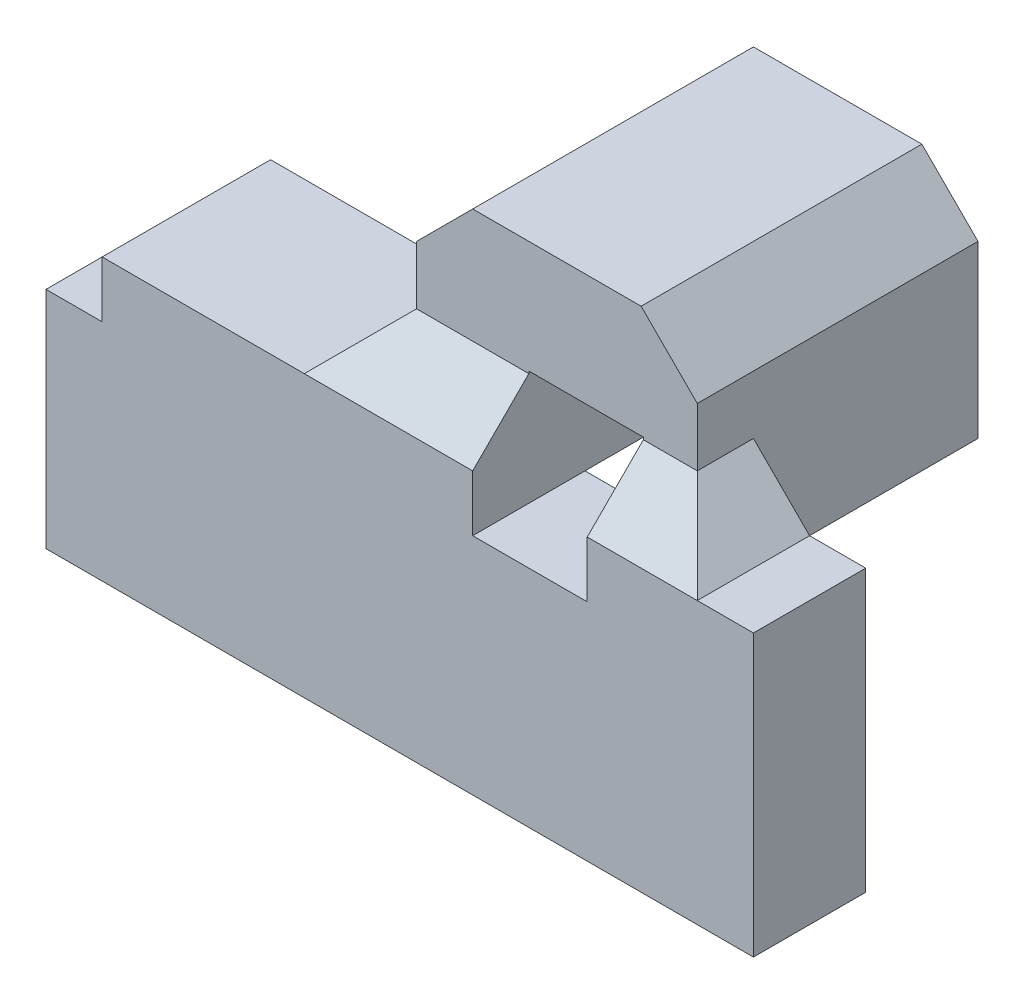
ISO-10303-21;
HEADER;
FILE_DESCRIPTION(('STEP AP214'),'2;1');
FILE_NAME('part.step','',(''),(''),'','','');
FILE_SCHEMA(('AUTOMOTIVE_DESIGN { 1 0 10303 214 1 1 1 1 }'));
ENDSEC;
DATA;
#1=APPLICATION_CONTEXT('core data for automotive mechanical design processes');
#2=APPLICATION_PROTOCOL_DEFINITION('international standard','automotive_design',2000,#1);
#3=PRODUCT_CONTEXT('',#1,'mechanical');
#4=PRODUCT('Part','Part','',(#3));
#5=PRODUCT_RELATED_PRODUCT_CATEGORY('part','',(#4));
#6=PRODUCT_DEFINITION_FORMATION('','',#4);
#7=PRODUCT_DEFINITION_CONTEXT('part definition',#1,'design');
#8=PRODUCT_DEFINITION('design','',#6,#7);
#9=PRODUCT_DEFINITION_SHAPE('','',#8);
#10=(LENGTH_UNIT() NAMED_UNIT(*) SI_UNIT(.MILLI.,.METRE.));
#11=(NAMED_UNIT(*) PLANE_ANGLE_UNIT() SI_UNIT($,.RADIAN.));
#12=(NAMED_UNIT(*) SI_UNIT($,.STERADIAN.) SOLID_ANGLE_UNIT());
#13=UNCERTAINTY_MEASURE_WITH_UNIT(LENGTH_MEASURE(1.E-05),#10,'distance_accuracy_value','');
#14=(GEOMETRIC_REPRESENTATION_CONTEXT(3) GLOBAL_UNCERTAINTY_ASSIGNED_CONTEXT((#13)) GLOBAL_UNIT_ASSIGNED_CONTEXT((#10,
#11,#12)) REPRESENTATION_CONTEXT('',''));
#15=CARTESIAN_POINT('',(0.,0.,0.));
#16=DIRECTION('',(0.,0.,1.));
#17=DIRECTION('',(1.,0.,0.));
#18=AXIS2_PLACEMENT_3D('',#15,#16,#17);
#19=CARTESIAN_POINT('',(-44.8113883008419,0.,-5.));
#20=DIRECTION('',(0.,0.,-1.));
#21=DIRECTION('',(-1.,0.,0.));
#22=AXIS2_PLACEMENT_3D('',#19,#20,#21);
#23=PLANE('',#22);
#24=DIRECTION('',(1.,0.,0.));
#25=VECTOR('',#24,1.);
#26=CARTESIAN_POINT('',(-44.8113883008419,15.,-5.));
#27=LINE('',#26,#25);
#28=CARTESIAN_POINT('',(-29.,15.,-5.));
#29=VERTEX_POINT('',#28);
#30=CARTESIAN_POINT('',(-11.,15.,-5.));
#31=VERTEX_POINT('',#30);
#32=EDGE_CURVE('E374',#29,#31,#27,.T.);
#33=ORIENTED_EDGE('',*,*,#32,.T.);
#34=DIRECTION('',(0.707106781186544,0.707106781186551,0.));
#35=VECTOR('',#34,1.);
#36=CARTESIAN_POINT('',(-11.,15.,-5.));
#37=LINE('',#36,#35);
#38=CARTESIAN_POINT('',(-6.,20.,-5.));
#39=VERTEX_POINT('',#38);
#40=EDGE_CURVE('E70',#31,#39,#37,.T.);
#41=ORIENTED_EDGE('',*,*,#40,.T.);
#42=DIRECTION('',(0.,-1.,0.));
#43=VECTOR('',#42,1.);
#44=CARTESIAN_POINT('',(-6.,0.,-5.));
#45=LINE('',#44,#43);
#46=CARTESIAN_POINT('',(-6.,10.,-5.));
#47=VERTEX_POINT('',#46);
#48=EDGE_CURVE('E63',#39,#47,#45,.T.);
#49=ORIENTED_EDGE('',*,*,#48,.T.);
#50=DIRECTION('',(1.,0.,0.));
#51=VECTOR('',#50,1.);
#52=CARTESIAN_POINT('',(-44.8113883008419,10.,-5.));
#53=LINE('',#52,#51);
#54=CARTESIAN_POINT('',(-29.,10.,-5.));
#55=VERTEX_POINT('',#54);
#56=EDGE_CURVE('E369',#55,#47,#53,.T.);
#57=ORIENTED_EDGE('',*,*,#56,.F.);
#58=DIRECTION('',(0.,-1.,0.));
#59=VECTOR('',#58,1.);
#60=CARTESIAN_POINT('',(-29.,0.,-5.));
#61=LINE('',#60,#59);
#62=EDGE_CURVE('E357',#29,#55,#61,.T.);
#63=ORIENTED_EDGE('',*,*,#62,.F.);
#64=EDGE_LOOP('',(#33,#41,#49,#57,#63));
#65=FACE_BOUND('',#64,.T.);
#66=ADVANCED_FACE('F47',(#65),#23,.T.);
#67=CARTESIAN_POINT('',(-44.8113883008419,15.,0.));
#68=DIRECTION('',(0.,1.,0.));
#69=DIRECTION('',(-1.,0.,0.));
#70=AXIS2_PLACEMENT_3D('',#67,#68,#69);
#71=PLANE('',#70);
#72=DIRECTION('',(1.,0.,0.));
#73=VECTOR('',#72,1.);
#74=CARTESIAN_POINT('',(-44.8113883008419,15.,10.));
#75=LINE('',#74,#73);
#76=CARTESIAN_POINT('',(-29.,15.,10.));
#77=VERTEX_POINT('',#76);
#78=CARTESIAN_POINT('',(-11.,15.,10.));
#79=VERTEX_POINT('',#78);
#80=EDGE_CURVE('E360',#77,#79,#75,.T.);
#81=ORIENTED_EDGE('',*,*,#80,.T.);
#82=DIRECTION('',(0.,0.,-1.));
#83=VECTOR('',#82,1.);
#84=CARTESIAN_POINT('',(-11.,15.,0.));
#85=LINE('',#84,#83);
#86=EDGE_CURVE('E246',#79,#31,#85,.T.);
#87=ORIENTED_EDGE('',*,*,#86,.T.);
#88=ORIENTED_EDGE('',*,*,#32,.F.);
#89=DIRECTION('',(0.,0.,-1.));
#90=VECTOR('',#89,1.);
#91=CARTESIAN_POINT('',(-29.,15.,0.));
#92=LINE('',#91,#90);
#93=EDGE_CURVE('E359',#77,#29,#92,.T.);
#94=ORIENTED_EDGE('',*,*,#93,.F.);
#95=EDGE_LOOP('',(#81,#87,#88,#94));
#96=FACE_BOUND('',#95,.T.);
#97=ADVANCED_FACE('F496',(#96),#71,.T.);
#98=DIRECTION('',(1.,0.,0.));
#99=VECTOR('',#98,1.);
#100=CARTESIAN_POINT('',(-44.8113883008419,15.,0.));
#101=LINE('',#100,#99);
#102=CARTESIAN_POINT('',(24.,15.,0.));
#103=VERTEX_POINT('',#102);
#104=CARTESIAN_POINT('',(29.,15.,0.));
#105=VERTEX_POINT('',#104);
#106=EDGE_CURVE('E220',#103,#105,#101,.T.);
#107=ORIENTED_EDGE('',*,*,#106,.F.);
#108=DIRECTION('',(0.,0.,1.));
#109=VECTOR('',#108,1.);
#110=CARTESIAN_POINT('',(24.,15.,5.));
#111=LINE('',#110,#109);
#112=CARTESIAN_POINT('',(24.,15.,10.));
#113=VERTEX_POINT('',#112);
#114=EDGE_CURVE('E229',#103,#113,#111,.T.);
#115=ORIENTED_EDGE('',*,*,#114,.T.);
#116=CARTESIAN_POINT('',(29.,15.,10.));
#117=VERTEX_POINT('',#116);
#118=EDGE_CURVE('E377',#113,#117,#75,.T.);
#119=ORIENTED_EDGE('',*,*,#118,.T.);
#120=DIRECTION('',(0.,0.,1.));
#121=VECTOR('',#120,1.);
#122=CARTESIAN_POINT('',(29.,15.,0.));
#123=LINE('',#122,#121);
#124=EDGE_CURVE('E367',#105,#117,#123,.T.);
#125=ORIENTED_EDGE('',*,*,#124,.F.);
#126=EDGE_LOOP('',(#107,#115,#119,#125));
#127=FACE_BOUND('',#126,.T.);
#128=ADVANCED_FACE('F502',(#127),#71,.T.);
#129=CARTESIAN_POINT('',(-29.,-10.,5.));
#130=DIRECTION('',(1.,0.,0.));
#131=DIRECTION('',(0.,1.,0.));
#132=AXIS2_PLACEMENT_3D('',#129,#130,#131);
#133=PLANE('',#132);
#134=DIRECTION('',(0.,0.,1.));
#135=VECTOR('',#134,1.);
#136=CARTESIAN_POINT('',(-29.,10.,0.));
#137=LINE('',#136,#135);
#138=CARTESIAN_POINT('',(-29.,10.,0.));
#139=VERTEX_POINT('',#138);
#140=EDGE_CURVE('E380',#55,#139,#137,.T.);
#141=ORIENTED_EDGE('',*,*,#140,.T.);
#142=CARTESIAN_POINT('',(-29.,10.,9.99999999999999));
#143=VERTEX_POINT('',#142);
#144=EDGE_CURVE('E364',#139,#143,#137,.T.);
#145=ORIENTED_EDGE('',*,*,#144,.T.);
#146=DIRECTION('',(0.,1.,0.));
#147=VECTOR('',#146,1.);
#148=CARTESIAN_POINT('',(-29.,0.,10.));
#149=LINE('',#148,#147);
#150=EDGE_CURVE('E362',#143,#77,#149,.T.);
#151=ORIENTED_EDGE('',*,*,#150,.T.);
#152=ORIENTED_EDGE('',*,*,#93,.T.);
#153=ORIENTED_EDGE('',*,*,#62,.T.);
#154=EDGE_LOOP('',(#141,#145,#151,#152,#153));
#155=FACE_BOUND('',#154,.T.);
#156=ADVANCED_FACE('F475',(#155),#133,.F.);
#157=CARTESIAN_POINT('',(29.,-10.,5.));
#158=DIRECTION('',(-1.,0.,0.));
#159=DIRECTION('',(0.,-1.,0.));
#160=AXIS2_PLACEMENT_3D('',#157,#158,#159);
#161=PLANE('',#160);
#162=DIRECTION('',(0.,1.,0.));
#163=VECTOR('',#162,1.);
#164=CARTESIAN_POINT('',(29.,-10.,0.));
#165=LINE('',#164,#163);
#166=CARTESIAN_POINT('',(29.,-10.,0.));
#167=VERTEX_POINT('',#166);
#168=EDGE_CURVE('E383',#167,#105,#165,.T.);
#169=ORIENTED_EDGE('',*,*,#168,.T.);
#170=ORIENTED_EDGE('',*,*,#124,.T.);
#171=DIRECTION('',(0.,-1.,0.));
#172=VECTOR('',#171,1.);
#173=CARTESIAN_POINT('',(29.,0.,10.));
#174=LINE('',#173,#172);
#175=CARTESIAN_POINT('',(29.,-10.,9.99999999999999));
#176=VERTEX_POINT('',#175);
#177=EDGE_CURVE('E354',#117,#176,#174,.T.);
#178=ORIENTED_EDGE('',*,*,#177,.T.);
#179=DIRECTION('',(0.,0.,-1.));
#180=VECTOR('',#179,1.);
#181=CARTESIAN_POINT('',(29.,-10.,5.));
#182=LINE('',#181,#180);
#183=EDGE_CURVE('E287',#176,#167,#182,.T.);
#184=ORIENTED_EDGE('',*,*,#183,.T.);
#185=EDGE_LOOP('',(#169,#170,#178,#184));
#186=FACE_BOUND('',#185,.T.);
#187=ADVANCED_FACE('F515',(#186),#161,.F.);
#188=CARTESIAN_POINT('',(-29.,-10.,5.));
#189=DIRECTION('',(0.,1.,0.));
#190=DIRECTION('',(0.,0.,1.));
#191=AXIS2_PLACEMENT_3D('',#188,#189,#190);
#192=PLANE('',#191);
#193=CARTESIAN_POINT('',(-19.,-10.,4.99999999999999));
#194=DIRECTION('',(0.,-1.,0.));
#195=DIRECTION('',(0.,0.,-1.));
#196=AXIS2_PLACEMENT_3D('',#193,#194,#195);
#197=CIRCLE('',#196,2.);
#198=CARTESIAN_POINT('',(-19.,-10.,3.));
#199=VERTEX_POINT('',#198);
#200=EDGE_CURVE('E294',#199,#199,#197,.T.);
#201=ORIENTED_EDGE('',*,*,#200,.F.);
#202=EDGE_LOOP('',(#201));
#203=FACE_BOUND('',#202,.T.);
#204=CARTESIAN_POINT('',(11.,-10.,4.99999999999999));
#205=DIRECTION('',(0.,-1.,0.));
#206=DIRECTION('',(0.,0.,-1.));
#207=AXIS2_PLACEMENT_3D('',#204,#205,#206);
#208=CIRCLE('',#207,2.);
#209=CARTESIAN_POINT('',(11.,-10.,3.));
#210=VERTEX_POINT('',#209);
#211=EDGE_CURVE('E297',#210,#210,#208,.T.);
#212=ORIENTED_EDGE('',*,*,#211,.F.);
#213=EDGE_LOOP('',(#212));
#214=FACE_BOUND('',#213,.T.);
#215=ORIENTED_EDGE('',*,*,#183,.F.);
#216=DIRECTION('',(1.,0.,0.));
#217=VECTOR('',#216,1.);
#218=CARTESIAN_POINT('',(0.,-10.,9.99999999999999));
#219=LINE('',#218,#217);
#220=CARTESIAN_POINT('',(-34.,-10.,9.99999999999999));
#221=VERTEX_POINT('',#220);
#222=EDGE_CURVE('E334',#221,#176,#219,.T.);
#223=ORIENTED_EDGE('',*,*,#222,.F.);
#224=DIRECTION('',(0.,0.,1.));
#225=VECTOR('',#224,1.);
#226=CARTESIAN_POINT('',(-34.,-10.,0.));
#227=LINE('',#226,#225);
#228=CARTESIAN_POINT('',(-34.,-10.,4.99999999999999));
#229=VERTEX_POINT('',#228);
#230=EDGE_CURVE('E348',#229,#221,#227,.T.);
#231=ORIENTED_EDGE('',*,*,#230,.F.);
#232=DIRECTION('',(-0.707106781186548,0.,0.707106781186547));
#233=VECTOR('',#232,1.);
#234=CARTESIAN_POINT('',(-14.5,-10.,-14.5));
#235=LINE('',#234,#233);
#236=CARTESIAN_POINT('',(-29.,-10.,0.));
#237=VERTEX_POINT('',#236);
#238=EDGE_CURVE('E341',#237,#229,#235,.T.);
#239=ORIENTED_EDGE('',*,*,#238,.F.);
#240=DIRECTION('',(1.,0.,0.));
#241=VECTOR('',#240,1.);
#242=CARTESIAN_POINT('',(-29.,-10.,0.));
#243=LINE('',#242,#241);
#244=EDGE_CURVE('E390',#237,#167,#243,.T.);
#245=ORIENTED_EDGE('',*,*,#244,.T.);
#246=EDGE_LOOP('',(#215,#223,#231,#239,#245));
#247=FACE_BOUND('',#246,.T.);
#248=ADVANCED_FACE('F463',(#203,#214,#247),#192,.F.);
#249=CARTESIAN_POINT('',(0.,0.,0.));
#250=DIRECTION('',(0.,0.,-1.));
#251=DIRECTION('',(-1.,0.,0.));
#252=AXIS2_PLACEMENT_3D('',#249,#250,#251);
#253=PLANE('',#252);
#254=ORIENTED_EDGE('',*,*,#168,.F.);
#255=ORIENTED_EDGE('',*,*,#244,.F.);
#256=DIRECTION('',(0.,-1.,0.));
#257=VECTOR('',#256,1.);
#258=CARTESIAN_POINT('',(-29.,-10.,0.));
#259=LINE('',#258,#257);
#260=EDGE_CURVE('E387',#139,#237,#259,.T.);
#261=ORIENTED_EDGE('',*,*,#260,.F.);
#262=DIRECTION('',(-1.,0.,0.));
#263=VECTOR('',#262,1.);
#264=CARTESIAN_POINT('',(-29.,10.,0.));
#265=LINE('',#264,#263);
#266=CARTESIAN_POINT('',(4.,10.,0.));
#267=VERTEX_POINT('',#266);
#268=EDGE_CURVE('E385',#267,#139,#265,.T.);
#269=ORIENTED_EDGE('',*,*,#268,.F.);
#270=CARTESIAN_POINT('',(14.2,10.,0.));
#271=VERTEX_POINT('',#270);
#272=EDGE_CURVE('E388',#271,#267,#265,.T.);
#273=ORIENTED_EDGE('',*,*,#272,.F.);
#274=CARTESIAN_POINT('',(19.,10.,0.));
#275=VERTEX_POINT('',#274);
#276=EDGE_CURVE('E215',#275,#271,#265,.T.);
#277=ORIENTED_EDGE('',*,*,#276,.F.);
#278=DIRECTION('',(0.,-1.,0.));
#279=VECTOR('',#278,1.);
#280=CARTESIAN_POINT('',(19.,20.,0.));
#281=LINE('',#280,#279);
#282=CARTESIAN_POINT('',(19.,20.,0.));
#283=VERTEX_POINT('',#282);
#284=EDGE_CURVE('E209',#283,#275,#281,.T.);
#285=ORIENTED_EDGE('',*,*,#284,.F.);
#286=DIRECTION('',(0.707106781186544,-0.707106781186551,0.));
#287=VECTOR('',#286,1.);
#288=CARTESIAN_POINT('',(19.,20.,0.));
#289=LINE('',#288,#287);
#290=EDGE_CURVE('E12',#103,#283,#289,.F.);
#291=ORIENTED_EDGE('',*,*,#290,.F.);
#292=ORIENTED_EDGE('',*,*,#106,.T.);
#293=EDGE_LOOP('',(#254,#255,#261,#269,#273,#277,#285,#291,#292));
#294=FACE_BOUND('',#293,.T.);
#295=ADVANCED_FACE('F211',(#294),#253,.T.);
#296=CARTESIAN_POINT('',(-44.8113883008419,0.,10.));
#297=DIRECTION('',(0.,0.,1.));
#298=DIRECTION('',(1.,0.,0.));
#299=AXIS2_PLACEMENT_3D('',#296,#297,#298);
#300=PLANE('',#299);
#301=DIRECTION('',(0.,1.,0.));
#302=VECTOR('',#301,1.);
#303=CARTESIAN_POINT('',(14.2,0.,10.));
#304=LINE('',#303,#302);
#305=CARTESIAN_POINT('',(14.2,10.,9.99999999999999));
#306=VERTEX_POINT('',#305);
#307=CARTESIAN_POINT('',(14.2,15.,10.));
#308=VERTEX_POINT('',#307);
#309=EDGE_CURVE('E307',#306,#308,#304,.T.);
#310=ORIENTED_EDGE('',*,*,#309,.F.);
#311=DIRECTION('',(1.,0.,0.));
#312=VECTOR('',#311,1.);
#313=CARTESIAN_POINT('',(-29.,10.,9.99999999999999));
#314=LINE('',#313,#312);
#315=CARTESIAN_POINT('',(4.,10.,9.99999999999999));
#316=VERTEX_POINT('',#315);
#317=EDGE_CURVE('E293',#316,#306,#314,.T.);
#318=ORIENTED_EDGE('',*,*,#317,.F.);
#319=DIRECTION('',(0.,1.,0.));
#320=VECTOR('',#319,1.);
#321=CARTESIAN_POINT('',(4.,0.,10.));
#322=LINE('',#321,#320);
#323=CARTESIAN_POINT('',(4.,15.,10.));
#324=VERTEX_POINT('',#323);
#325=EDGE_CURVE('E304',#316,#324,#322,.T.);
#326=ORIENTED_EDGE('',*,*,#325,.T.);
#327=EDGE_CURVE('E372',#79,#324,#75,.T.);
#328=ORIENTED_EDGE('',*,*,#327,.F.);
#329=ORIENTED_EDGE('',*,*,#80,.F.);
#330=ORIENTED_EDGE('',*,*,#150,.F.);
#331=DIRECTION('',(1.,0.,0.));
#332=VECTOR('',#331,1.);
#333=CARTESIAN_POINT('',(0.,10.,9.99999999999999));
#334=LINE('',#333,#332);
#335=CARTESIAN_POINT('',(-34.,10.,9.99999999999999));
#336=VERTEX_POINT('',#335);
#337=EDGE_CURVE('E337',#336,#143,#334,.T.);
#338=ORIENTED_EDGE('',*,*,#337,.F.);
#339=DIRECTION('',(0.,-1.,0.));
#340=VECTOR('',#339,1.);
#341=CARTESIAN_POINT('',(-34.,10.,9.99999999999999));
#342=LINE('',#341,#340);
#343=EDGE_CURVE('E345',#336,#221,#342,.T.);
#344=ORIENTED_EDGE('',*,*,#343,.T.);
#345=ORIENTED_EDGE('',*,*,#222,.T.);
#346=ORIENTED_EDGE('',*,*,#177,.F.);
#347=ORIENTED_EDGE('',*,*,#118,.F.);
#348=EDGE_CURVE('E373',#308,#113,#75,.T.);
#349=ORIENTED_EDGE('',*,*,#348,.F.);
#350=EDGE_LOOP('',(#310,#318,#326,#328,#329,#330,#338,#344,#345,#346,#347,#349));
#351=FACE_BOUND('',#350,.T.);
#352=ADVANCED_FACE('F441',(#351),#300,.T.);
#353=CARTESIAN_POINT('',(-44.8113883008419,10.,0.));
#354=DIRECTION('',(0.,-1.,0.));
#355=DIRECTION('',(1.,0.,0.));
#356=AXIS2_PLACEMENT_3D('',#353,#354,#355);
#357=PLANE('',#356);
#358=DIRECTION('',(0.,0.,-1.));
#359=VECTOR('',#358,1.);
#360=CARTESIAN_POINT('',(19.,10.,0.));
#361=LINE('',#360,#359);
#362=CARTESIAN_POINT('',(19.,10.,-20.));
#363=VERTEX_POINT('',#362);
#364=EDGE_CURVE('E221',#275,#363,#361,.T.);
#365=ORIENTED_EDGE('',*,*,#364,.F.);
#366=ORIENTED_EDGE('',*,*,#276,.T.);
#367=DIRECTION('',(0.,0.,1.));
#368=VECTOR('',#367,1.);
#369=CARTESIAN_POINT('',(14.2,10.,-5.));
#370=LINE('',#369,#368);
#371=CARTESIAN_POINT('',(14.2,10.,-15.));
#372=VERTEX_POINT('',#371);
#373=EDGE_CURVE('E310',#372,#271,#370,.T.);
#374=ORIENTED_EDGE('',*,*,#373,.F.);
#375=DIRECTION('',(-1.,0.,0.));
#376=VECTOR('',#375,1.);
#377=CARTESIAN_POINT('',(0.,10.,-15.));
#378=LINE('',#377,#376);
#379=CARTESIAN_POINT('',(4.,10.,-15.));
#380=VERTEX_POINT('',#379);
#381=EDGE_CURVE('E255',#372,#380,#378,.T.);
#382=ORIENTED_EDGE('',*,*,#381,.T.);
#383=DIRECTION('',(0.,0.,1.));
#384=VECTOR('',#383,1.);
#385=CARTESIAN_POINT('',(4.,10.,-5.));
#386=LINE('',#385,#384);
#387=EDGE_CURVE('E314',#380,#267,#386,.T.);
#388=ORIENTED_EDGE('',*,*,#387,.T.);
#389=ORIENTED_EDGE('',*,*,#268,.T.);
#390=ORIENTED_EDGE('',*,*,#140,.F.);
#391=ORIENTED_EDGE('',*,*,#56,.T.);
#392=DIRECTION('',(0.,0.,1.));
#393=VECTOR('',#392,1.);
#394=CARTESIAN_POINT('',(-6.,10.,-15.));
#395=LINE('',#394,#393);
#396=CARTESIAN_POINT('',(-6.,10.,-20.));
#397=VERTEX_POINT('',#396);
#398=EDGE_CURVE('E284',#397,#47,#395,.T.);
#399=ORIENTED_EDGE('',*,*,#398,.F.);
#400=DIRECTION('',(-1.,0.,0.));
#401=VECTOR('',#400,1.);
#402=CARTESIAN_POINT('',(0.,10.,-20.));
#403=LINE('',#402,#401);
#404=EDGE_CURVE('E263',#363,#397,#403,.T.);
#405=ORIENTED_EDGE('',*,*,#404,.F.);
#406=EDGE_LOOP('',(#365,#366,#374,#382,#388,#389,#390,#391,#399,#405));
#407=FACE_BOUND('',#406,.T.);
#408=ADVANCED_FACE('F450',(#407),#357,.T.);
#409=CARTESIAN_POINT('',(0.,10.,0.));
#410=DIRECTION('',(0.,-1.,0.));
#411=DIRECTION('',(0.,0.,-1.));
#412=AXIS2_PLACEMENT_3D('',#409,#410,#411);
#413=PLANE('',#412);
#414=ORIENTED_EDGE('',*,*,#337,.T.);
#415=ORIENTED_EDGE('',*,*,#144,.F.);
#416=DIRECTION('',(-0.707106781186548,0.,0.707106781186547));
#417=VECTOR('',#416,1.);
#418=CARTESIAN_POINT('',(-14.5,10.,-14.5));
#419=LINE('',#418,#417);
#420=CARTESIAN_POINT('',(-34.,10.,4.99999999999999));
#421=VERTEX_POINT('',#420);
#422=EDGE_CURVE('E343',#139,#421,#419,.T.);
#423=ORIENTED_EDGE('',*,*,#422,.T.);
#424=DIRECTION('',(0.,0.,1.));
#425=VECTOR('',#424,1.);
#426=CARTESIAN_POINT('',(-34.,10.,0.));
#427=LINE('',#426,#425);
#428=EDGE_CURVE('E340',#421,#336,#427,.T.);
#429=ORIENTED_EDGE('',*,*,#428,.T.);
#430=EDGE_LOOP('',(#414,#415,#423,#429));
#431=FACE_BOUND('',#430,.T.);
#432=ADVANCED_FACE('F473',(#431),#413,.F.);
#433=CARTESIAN_POINT('',(-14.5,10.,-14.5));
#434=DIRECTION('',(0.707106781186547,0.,0.707106781186548));
#435=DIRECTION('',(0.707106781186548,0.,-0.707106781186547));
#436=AXIS2_PLACEMENT_3D('',#433,#434,#435);
#437=PLANE('',#436);
#438=ORIENTED_EDGE('',*,*,#238,.T.);
#439=DIRECTION('',(0.,-1.,0.));
#440=VECTOR('',#439,1.);
#441=CARTESIAN_POINT('',(-34.,10.,4.99999999999999));
#442=LINE('',#441,#440);
#443=EDGE_CURVE('E351',#421,#229,#442,.T.);
#444=ORIENTED_EDGE('',*,*,#443,.F.);
#445=ORIENTED_EDGE('',*,*,#422,.F.);
#446=ORIENTED_EDGE('',*,*,#260,.T.);
#447=EDGE_LOOP('',(#438,#444,#445,#446));
#448=FACE_BOUND('',#447,.T.);
#449=ADVANCED_FACE('F459',(#448),#437,.F.);
#450=CARTESIAN_POINT('',(-34.,10.,0.));
#451=DIRECTION('',(1.,0.,0.));
#452=DIRECTION('',(0.,0.,-1.));
#453=AXIS2_PLACEMENT_3D('',#450,#451,#452);
#454=PLANE('',#453);
#455=ORIENTED_EDGE('',*,*,#230,.T.);
#456=ORIENTED_EDGE('',*,*,#343,.F.);
#457=ORIENTED_EDGE('',*,*,#428,.F.);
#458=ORIENTED_EDGE('',*,*,#443,.T.);
#459=EDGE_LOOP('',(#455,#456,#457,#458));
#460=FACE_BOUND('',#459,.T.);
#461=ADVANCED_FACE('F467',(#460),#454,.F.);
#462=CARTESIAN_POINT('',(14.2,0.,-5.));
#463=DIRECTION('',(1.,0.,0.));
#464=DIRECTION('',(0.,0.,-1.));
#465=AXIS2_PLACEMENT_3D('',#462,#463,#464);
#466=PLANE('',#465);
#467=DIRECTION('',(0.,0.,1.));
#468=VECTOR('',#467,1.);
#469=CARTESIAN_POINT('',(14.2,20.2,-5.));
#470=LINE('',#469,#468);
#471=CARTESIAN_POINT('',(14.2,20.2,-15.));
#472=VERTEX_POINT('',#471);
#473=CARTESIAN_POINT('',(14.2,20.2,5.));
#474=VERTEX_POINT('',#473);
#475=EDGE_CURVE('E331',#472,#474,#470,.T.);
#476=ORIENTED_EDGE('',*,*,#475,.F.);
#477=DIRECTION('',(0.,1.,0.));
#478=VECTOR('',#477,1.);
#479=CARTESIAN_POINT('',(14.2,0.,-15.));
#480=LINE('',#479,#478);
#481=EDGE_CURVE('E273',#372,#472,#480,.T.);
#482=ORIENTED_EDGE('',*,*,#481,.F.);
#483=ORIENTED_EDGE('',*,*,#373,.T.);
#484=EDGE_CURVE('E313',#271,#306,#370,.T.);
#485=ORIENTED_EDGE('',*,*,#484,.T.);
#486=ORIENTED_EDGE('',*,*,#309,.T.);
#487=DIRECTION('',(0.,-0.707106781186551,0.707106781186544));
#488=VECTOR('',#487,1.);
#489=CARTESIAN_POINT('',(14.2,14.9999999999999,10.0000000000001));
#490=LINE('',#489,#488);
#491=CARTESIAN_POINT('',(14.2,20.,5.));
#492=VERTEX_POINT('',#491);
#493=EDGE_CURVE('E250',#308,#492,#490,.F.);
#494=ORIENTED_EDGE('',*,*,#493,.T.);
#495=DIRECTION('',(0.,1.,0.));
#496=VECTOR('',#495,1.);
#497=CARTESIAN_POINT('',(14.2,0.,5.));
#498=LINE('',#497,#496);
#499=EDGE_CURVE('E328',#492,#474,#498,.T.);
#500=ORIENTED_EDGE('',*,*,#499,.T.);
#501=EDGE_LOOP('',(#476,#482,#483,#485,#486,#494,#500));
#502=FACE_BOUND('',#501,.T.);
#503=ADVANCED_FACE('F585',(#502),#466,.F.);
#504=CARTESIAN_POINT('',(0.,20.2,-5.));
#505=DIRECTION('',(0.,1.,0.));
#506=DIRECTION('',(0.,0.,1.));
#507=AXIS2_PLACEMENT_3D('',#504,#505,#506);
#508=PLANE('',#507);
#509=DIRECTION('',(-1.,0.,0.));
#510=VECTOR('',#509,1.);
#511=CARTESIAN_POINT('',(0.,20.2,5.));
#512=LINE('',#511,#510);
#513=CARTESIAN_POINT('',(4.,20.2,5.));
#514=VERTEX_POINT('',#513);
#515=EDGE_CURVE('E325',#474,#514,#512,.T.);
#516=ORIENTED_EDGE('',*,*,#515,.T.);
#517=DIRECTION('',(0.,0.,1.));
#518=VECTOR('',#517,1.);
#519=CARTESIAN_POINT('',(4.,20.2,-5.));
#520=LINE('',#519,#518);
#521=CARTESIAN_POINT('',(4.,20.2,-15.));
#522=VERTEX_POINT('',#521);
#523=EDGE_CURVE('E330',#522,#514,#520,.T.);
#524=ORIENTED_EDGE('',*,*,#523,.F.);
#525=DIRECTION('',(-1.,0.,0.));
#526=VECTOR('',#525,1.);
#527=CARTESIAN_POINT('',(0.,20.2,-15.));
#528=LINE('',#527,#526);
#529=EDGE_CURVE('E278',#472,#522,#528,.T.);
#530=ORIENTED_EDGE('',*,*,#529,.F.);
#531=ORIENTED_EDGE('',*,*,#475,.T.);
#532=EDGE_LOOP('',(#516,#524,#530,#531));
#533=FACE_BOUND('',#532,.T.);
#534=ADVANCED_FACE('F493',(#533),#508,.F.);
#535=CARTESIAN_POINT('',(4.,0.,-5.));
#536=DIRECTION('',(1.,0.,0.));
#537=DIRECTION('',(0.,0.,-1.));
#538=AXIS2_PLACEMENT_3D('',#535,#536,#537);
#539=PLANE('',#538);
#540=DIRECTION('',(0.,1.,0.));
#541=VECTOR('',#540,1.);
#542=CARTESIAN_POINT('',(4.,0.,5.));
#543=LINE('',#542,#541);
#544=CARTESIAN_POINT('',(4.,20.,5.));
#545=VERTEX_POINT('',#544);
#546=EDGE_CURVE('E323',#545,#514,#543,.T.);
#547=ORIENTED_EDGE('',*,*,#546,.F.);
#548=DIRECTION('',(0.,0.707106781186551,-0.707106781186544));
#549=VECTOR('',#548,1.);
#550=CARTESIAN_POINT('',(4.,20.,5.));
#551=LINE('',#550,#549);
#552=EDGE_CURVE('E56',#545,#324,#551,.F.);
#553=ORIENTED_EDGE('',*,*,#552,.T.);
#554=ORIENTED_EDGE('',*,*,#325,.F.);
#555=EDGE_CURVE('E309',#267,#316,#386,.T.);
#556=ORIENTED_EDGE('',*,*,#555,.F.);
#557=ORIENTED_EDGE('',*,*,#387,.F.);
#558=DIRECTION('',(0.,-1.,0.));
#559=VECTOR('',#558,1.);
#560=CARTESIAN_POINT('',(4.,0.,-15.));
#561=LINE('',#560,#559);
#562=EDGE_CURVE('E281',#522,#380,#561,.T.);
#563=ORIENTED_EDGE('',*,*,#562,.F.);
#564=ORIENTED_EDGE('',*,*,#523,.T.);
#565=EDGE_LOOP('',(#547,#553,#554,#556,#557,#563,#564));
#566=FACE_BOUND('',#565,.T.);
#567=ADVANCED_FACE('F436',(#566),#539,.T.);
#568=CARTESIAN_POINT('',(-6.,0.,-5.));
#569=DIRECTION('',(1.,0.,0.));
#570=DIRECTION('',(0.,1.,0.));
#571=AXIS2_PLACEMENT_3D('',#568,#569,#570);
#572=PLANE('',#571);
#573=ORIENTED_EDGE('',*,*,#48,.F.);
#574=DIRECTION('',(0.,0.,1.));
#575=VECTOR('',#574,1.);
#576=CARTESIAN_POINT('',(-6.,20.,-5.));
#577=LINE('',#576,#575);
#578=CARTESIAN_POINT('',(-6.,20.,5.));
#579=VERTEX_POINT('',#578);
#580=EDGE_CURVE('E248',#39,#579,#577,.T.);
#581=ORIENTED_EDGE('',*,*,#580,.T.);
#582=DIRECTION('',(0.,1.,0.));
#583=VECTOR('',#582,1.);
#584=CARTESIAN_POINT('',(-6.,0.,5.));
#585=LINE('',#584,#583);
#586=CARTESIAN_POINT('',(-6.,25.2,5.));
#587=VERTEX_POINT('',#586);
#588=EDGE_CURVE('E321',#579,#587,#585,.T.);
#589=ORIENTED_EDGE('',*,*,#588,.T.);
#590=DIRECTION('',(0.,0.,-1.));
#591=VECTOR('',#590,1.);
#592=CARTESIAN_POINT('',(-6.,25.2,-5.));
#593=LINE('',#592,#591);
#594=CARTESIAN_POINT('',(-6.,25.2,-20.));
#595=VERTEX_POINT('',#594);
#596=EDGE_CURVE('E235',#587,#595,#593,.T.);
#597=ORIENTED_EDGE('',*,*,#596,.T.);
#598=DIRECTION('',(0.,1.,0.));
#599=VECTOR('',#598,1.);
#600=CARTESIAN_POINT('',(-6.,0.,-20.));
#601=LINE('',#600,#599);
#602=EDGE_CURVE('E265',#397,#595,#601,.T.);
#603=ORIENTED_EDGE('',*,*,#602,.F.);
#604=ORIENTED_EDGE('',*,*,#398,.T.);
#605=EDGE_LOOP('',(#573,#581,#589,#597,#603,#604));
#606=FACE_BOUND('',#605,.T.);
#607=ADVANCED_FACE('F484',(#606),#572,.F.);
#608=CARTESIAN_POINT('',(0.,30.2,-5.));
#609=DIRECTION('',(0.,-1.,0.));
#610=DIRECTION('',(0.,0.,-1.));
#611=AXIS2_PLACEMENT_3D('',#608,#609,#610);
#612=PLANE('',#611);
#613=DIRECTION('',(1.,0.,0.));
#614=VECTOR('',#613,1.);
#615=CARTESIAN_POINT('',(0.,30.2,5.));
#616=LINE('',#615,#614);
#617=CARTESIAN_POINT('',(-1.00000000000001,30.2,5.));
#618=VERTEX_POINT('',#617);
#619=CARTESIAN_POINT('',(14.,30.2,5.));
#620=VERTEX_POINT('',#619);
#621=EDGE_CURVE('E318',#618,#620,#616,.T.);
#622=ORIENTED_EDGE('',*,*,#621,.T.);
#623=DIRECTION('',(0.,0.,-1.));
#624=VECTOR('',#623,1.);
#625=CARTESIAN_POINT('',(14.,30.2,-20.));
#626=LINE('',#625,#624);
#627=CARTESIAN_POINT('',(14.,30.2,-20.));
#628=VERTEX_POINT('',#627);
#629=EDGE_CURVE('E403',#620,#628,#626,.T.);
#630=ORIENTED_EDGE('',*,*,#629,.T.);
#631=DIRECTION('',(1.,0.,0.));
#632=VECTOR('',#631,1.);
#633=CARTESIAN_POINT('',(0.,30.2,-20.));
#634=LINE('',#633,#632);
#635=CARTESIAN_POINT('',(-1.00000000000001,30.2,-20.));
#636=VERTEX_POINT('',#635);
#637=EDGE_CURVE('E268',#636,#628,#634,.T.);
#638=ORIENTED_EDGE('',*,*,#637,.F.);
#639=DIRECTION('',(0.,0.,1.));
#640=VECTOR('',#639,1.);
#641=CARTESIAN_POINT('',(-1.00000000000001,30.2,-5.));
#642=LINE('',#641,#640);
#643=EDGE_CURVE('E400',#636,#618,#642,.T.);
#644=ORIENTED_EDGE('',*,*,#643,.T.);
#645=EDGE_LOOP('',(#622,#630,#638,#644));
#646=FACE_BOUND('',#645,.T.);
#647=ADVANCED_FACE('F422',(#646),#612,.F.);
#648=CARTESIAN_POINT('',(19.,0.,-5.));
#649=DIRECTION('',(1.,0.,0.));
#650=DIRECTION('',(0.,0.,-1.));
#651=AXIS2_PLACEMENT_3D('',#648,#649,#650);
#652=PLANE('',#651);
#653=DIRECTION('',(0.,1.,0.));
#654=VECTOR('',#653,1.);
#655=CARTESIAN_POINT('',(19.,0.,5.));
#656=LINE('',#655,#654);
#657=CARTESIAN_POINT('',(19.,20.,5.));
#658=VERTEX_POINT('',#657);
#659=CARTESIAN_POINT('',(19.,25.2,5.));
#660=VERTEX_POINT('',#659);
#661=EDGE_CURVE('E233',#658,#660,#656,.T.);
#662=ORIENTED_EDGE('',*,*,#661,.F.);
#663=DIRECTION('',(0.,0.,-1.));
#664=VECTOR('',#663,1.);
#665=CARTESIAN_POINT('',(19.,20.,-20.));
#666=LINE('',#665,#664);
#667=EDGE_CURVE('E228',#658,#283,#666,.T.);
#668=ORIENTED_EDGE('',*,*,#667,.T.);
#669=ORIENTED_EDGE('',*,*,#284,.T.);
#670=ORIENTED_EDGE('',*,*,#364,.T.);
#671=DIRECTION('',(0.,-1.,0.));
#672=VECTOR('',#671,1.);
#673=CARTESIAN_POINT('',(19.,0.,-20.));
#674=LINE('',#673,#672);
#675=CARTESIAN_POINT('',(19.,25.2,-20.));
#676=VERTEX_POINT('',#675);
#677=EDGE_CURVE('E271',#676,#363,#674,.T.);
#678=ORIENTED_EDGE('',*,*,#677,.F.);
#679=DIRECTION('',(0.,0.,1.));
#680=VECTOR('',#679,1.);
#681=CARTESIAN_POINT('',(19.,25.2,5.));
#682=LINE('',#681,#680);
#683=EDGE_CURVE('E286',#676,#660,#682,.T.);
#684=ORIENTED_EDGE('',*,*,#683,.T.);
#685=EDGE_LOOP('',(#662,#668,#669,#670,#678,#684));
#686=FACE_BOUND('',#685,.T.);
#687=ADVANCED_FACE('F231',(#686),#652,.T.);
#688=CARTESIAN_POINT('',(0.,0.,5.));
#689=DIRECTION('',(0.,0.,1.));
#690=DIRECTION('',(1.,0.,0.));
#691=AXIS2_PLACEMENT_3D('',#688,#689,#690);
#692=PLANE('',#691);
#693=ORIENTED_EDGE('',*,*,#499,.F.);
#694=DIRECTION('',(1.,0.,0.));
#695=VECTOR('',#694,1.);
#696=CARTESIAN_POINT('',(19.,20.,5.));
#697=LINE('',#696,#695);
#698=EDGE_CURVE('E244',#492,#658,#697,.T.);
#699=ORIENTED_EDGE('',*,*,#698,.T.);
#700=ORIENTED_EDGE('',*,*,#661,.T.);
#701=DIRECTION('',(-0.707106781186549,0.707106781186547,0.));
#702=VECTOR('',#701,1.);
#703=CARTESIAN_POINT('',(22.1,22.1,5.));
#704=LINE('',#703,#702);
#705=EDGE_CURVE('E398',#660,#620,#704,.T.);
#706=ORIENTED_EDGE('',*,*,#705,.T.);
#707=ORIENTED_EDGE('',*,*,#621,.F.);
#708=DIRECTION('',(0.707106781186546,0.707106781186549,0.));
#709=VECTOR('',#708,1.);
#710=CARTESIAN_POINT('',(-15.6,15.5999999999999,5.));
#711=LINE('',#710,#709);
#712=EDGE_CURVE('E395',#618,#587,#711,.F.);
#713=ORIENTED_EDGE('',*,*,#712,.T.);
#714=ORIENTED_EDGE('',*,*,#588,.F.);
#715=DIRECTION('',(1.,0.,0.));
#716=VECTOR('',#715,1.);
#717=CARTESIAN_POINT('',(4.,20.,5.));
#718=LINE('',#717,#716);
#719=EDGE_CURVE('E237',#579,#545,#718,.T.);
#720=ORIENTED_EDGE('',*,*,#719,.T.);
#721=ORIENTED_EDGE('',*,*,#546,.T.);
#722=ORIENTED_EDGE('',*,*,#515,.F.);
#723=EDGE_LOOP('',(#693,#699,#700,#706,#707,#713,#714,#720,#721,#722));
#724=FACE_BOUND('',#723,.T.);
#725=ADVANCED_FACE('F420',(#724),#692,.T.);
#726=CARTESIAN_POINT('',(0.,10.,-5.));
#727=DIRECTION('',(0.,1.,0.));
#728=DIRECTION('',(0.,0.,1.));
#729=AXIS2_PLACEMENT_3D('',#726,#727,#728);
#730=PLANE('',#729);
#731=ORIENTED_EDGE('',*,*,#555,.T.);
#732=ORIENTED_EDGE('',*,*,#317,.T.);
#733=ORIENTED_EDGE('',*,*,#484,.F.);
#734=ORIENTED_EDGE('',*,*,#272,.T.);
#735=EDGE_LOOP('',(#731,#732,#733,#734));
#736=FACE_BOUND('',#735,.T.);
#737=ADVANCED_FACE('F446',(#736),#730,.T.);
#738=CARTESIAN_POINT('',(11.,0.,4.99999999999999));
#739=DIRECTION('',(0.,-1.,0.));
#740=DIRECTION('',(0.,0.,-1.));
#741=AXIS2_PLACEMENT_3D('',#738,#739,#740);
#742=CYLINDRICAL_SURFACE('',#741,2.);
#743=CARTESIAN_POINT('',(11.,0.,4.99999999999999));
#744=DIRECTION('',(0.,-1.,0.));
#745=DIRECTION('',(0.,0.,-1.));
#746=AXIS2_PLACEMENT_3D('',#743,#744,#745);
#747=CIRCLE('',#746,2.);
#748=CARTESIAN_POINT('',(11.,0.,3.));
#749=VERTEX_POINT('',#748);
#750=EDGE_CURVE('E289',#749,#749,#747,.T.);
#751=ORIENTED_EDGE('',*,*,#750,.F.);
#752=EDGE_LOOP('',(#751));
#753=FACE_BOUND('',#752,.T.);
#754=ORIENTED_EDGE('',*,*,#211,.T.);
#755=EDGE_LOOP('',(#754));
#756=FACE_BOUND('',#755,.T.);
#757=ADVANCED_FACE('F620',(#753,#756),#742,.F.);
#758=CARTESIAN_POINT('',(11.,0.,4.99999999999999));
#759=DIRECTION('',(0.,-1.,0.));
#760=DIRECTION('',(0.,0.,-1.));
#761=AXIS2_PLACEMENT_3D('',#758,#759,#760);
#762=PLANE('',#761);
#763=ORIENTED_EDGE('',*,*,#750,.T.);
#764=EDGE_LOOP('',(#763));
#765=FACE_BOUND('',#764,.T.);
#766=ADVANCED_FACE('F671',(#765),#762,.T.);
#767=CARTESIAN_POINT('',(-19.,0.,4.99999999999999));
#768=DIRECTION('',(0.,-1.,0.));
#769=DIRECTION('',(0.,0.,-1.));
#770=AXIS2_PLACEMENT_3D('',#767,#768,#769);
#771=CYLINDRICAL_SURFACE('',#770,2.);
#772=CARTESIAN_POINT('',(-19.,0.,4.99999999999999));
#773=DIRECTION('',(0.,-1.,0.));
#774=DIRECTION('',(0.,0.,-1.));
#775=AXIS2_PLACEMENT_3D('',#772,#773,#774);
#776=CIRCLE('',#775,2.);
#777=CARTESIAN_POINT('',(-19.,0.,3.));
#778=VERTEX_POINT('',#777);
#779=EDGE_CURVE('E290',#778,#778,#776,.T.);
#780=ORIENTED_EDGE('',*,*,#779,.F.);
#781=EDGE_LOOP('',(#780));
#782=FACE_BOUND('',#781,.T.);
#783=ORIENTED_EDGE('',*,*,#200,.T.);
#784=EDGE_LOOP('',(#783));
#785=FACE_BOUND('',#784,.T.);
#786=ADVANCED_FACE('F679',(#782,#785),#771,.F.);
#787=CARTESIAN_POINT('',(-19.,0.,4.99999999999999));
#788=DIRECTION('',(0.,-1.,0.));
#789=DIRECTION('',(0.,0.,-1.));
#790=AXIS2_PLACEMENT_3D('',#787,#788,#789);
#791=PLANE('',#790);
#792=ORIENTED_EDGE('',*,*,#779,.T.);
#793=EDGE_LOOP('',(#792));
#794=FACE_BOUND('',#793,.T.);
#795=ADVANCED_FACE('F688',(#794),#791,.T.);
#796=CARTESIAN_POINT('',(0.,0.,-15.));
#797=DIRECTION('',(0.,0.,-1.));
#798=DIRECTION('',(-1.,0.,0.));
#799=AXIS2_PLACEMENT_3D('',#796,#797,#798);
#800=PLANE('',#799);
#801=ORIENTED_EDGE('',*,*,#381,.F.);
#802=ORIENTED_EDGE('',*,*,#481,.T.);
#803=ORIENTED_EDGE('',*,*,#529,.T.);
#804=ORIENTED_EDGE('',*,*,#562,.T.);
#805=EDGE_LOOP('',(#801,#802,#803,#804));
#806=FACE_BOUND('',#805,.T.);
#807=ADVANCED_FACE('F697',(#806),#800,.F.);
#808=CARTESIAN_POINT('',(0.,0.,-20.));
#809=DIRECTION('',(0.,0.,-1.));
#810=DIRECTION('',(-1.,0.,0.));
#811=AXIS2_PLACEMENT_3D('',#808,#809,#810);
#812=PLANE('',#811);
#813=ORIENTED_EDGE('',*,*,#677,.T.);
#814=ORIENTED_EDGE('',*,*,#404,.T.);
#815=ORIENTED_EDGE('',*,*,#602,.T.);
#816=DIRECTION('',(-0.707106781186546,-0.707106781186549,0.));
#817=VECTOR('',#816,1.);
#818=CARTESIAN_POINT('',(-15.6,15.5999999999999,-20.));
#819=LINE('',#818,#817);
#820=EDGE_CURVE('E405',#595,#636,#819,.F.);
#821=ORIENTED_EDGE('',*,*,#820,.T.);
#822=ORIENTED_EDGE('',*,*,#637,.T.);
#823=DIRECTION('',(0.707106781186549,-0.707106781186547,0.));
#824=VECTOR('',#823,1.);
#825=CARTESIAN_POINT('',(22.1,22.1,-20.));
#826=LINE('',#825,#824);
#827=EDGE_CURVE('E239',#628,#676,#826,.T.);
#828=ORIENTED_EDGE('',*,*,#827,.T.);
#829=EDGE_LOOP('',(#813,#814,#815,#821,#822,#828));
#830=FACE_BOUND('',#829,.T.);
#831=ADVANCED_FACE('F409',(#830),#812,.T.);
#832=CARTESIAN_POINT('',(19.,25.2,-5.));
#833=DIRECTION('',(0.707106781186546,0.707106781186548,0.));
#834=DIRECTION('',(0.,0.,-1.));
#835=AXIS2_PLACEMENT_3D('',#832,#833,#834);
#836=PLANE('',#835);
#837=ORIENTED_EDGE('',*,*,#827,.F.);
#838=ORIENTED_EDGE('',*,*,#629,.F.);
#839=ORIENTED_EDGE('',*,*,#705,.F.);
#840=ORIENTED_EDGE('',*,*,#683,.F.);
#841=EDGE_LOOP('',(#837,#838,#839,#840));
#842=FACE_BOUND('',#841,.T.);
#843=ADVANCED_FACE('F416',(#842),#836,.T.);
#844=CARTESIAN_POINT('',(-1.00000000000001,30.2,-5.));
#845=DIRECTION('',(0.707106781186549,-0.707106781186546,0.));
#846=DIRECTION('',(0.,0.,1.));
#847=AXIS2_PLACEMENT_3D('',#844,#845,#846);
#848=PLANE('',#847);
#849=ORIENTED_EDGE('',*,*,#820,.F.);
#850=ORIENTED_EDGE('',*,*,#596,.F.);
#851=ORIENTED_EDGE('',*,*,#712,.F.);
#852=ORIENTED_EDGE('',*,*,#643,.F.);
#853=EDGE_LOOP('',(#849,#850,#851,#852));
#854=FACE_BOUND('',#853,.T.);
#855=ADVANCED_FACE('F426',(#854),#848,.F.);
#856=CARTESIAN_POINT('',(0.,20.0000000000001,5.));
#857=DIRECTION('',(0.,0.707106781186544,0.707106781186551));
#858=DIRECTION('',(-1.,0.,0.));
#859=AXIS2_PLACEMENT_3D('',#856,#857,#858);
#860=PLANE('',#859);
#861=ORIENTED_EDGE('',*,*,#493,.F.);
#862=ORIENTED_EDGE('',*,*,#348,.T.);
#863=DIRECTION('',(-0.577350269189624,0.57735026918963,-0.577350269189624));
#864=VECTOR('',#863,1.);
#865=CARTESIAN_POINT('',(12.6666666666667,26.3333333333334,-1.33333333333329));
#866=LINE('',#865,#864);
#867=EDGE_CURVE('E254',#658,#113,#866,.F.);
#868=ORIENTED_EDGE('',*,*,#867,.F.);
#869=ORIENTED_EDGE('',*,*,#698,.F.);
#870=EDGE_LOOP('',(#861,#862,#868,#869));
#871=FACE_BOUND('',#870,.T.);
#872=ADVANCED_FACE('F532',(#871),#860,.T.);
#873=CARTESIAN_POINT('',(19.,20.,-5.));
#874=DIRECTION('',(0.707106781186551,0.707106781186544,0.));
#875=DIRECTION('',(0.,0.,1.));
#876=AXIS2_PLACEMENT_3D('',#873,#874,#875);
#877=PLANE('',#876);
#878=ORIENTED_EDGE('',*,*,#114,.F.);
#879=ORIENTED_EDGE('',*,*,#290,.T.);
#880=ORIENTED_EDGE('',*,*,#667,.F.);
#881=ORIENTED_EDGE('',*,*,#867,.T.);
#882=EDGE_LOOP('',(#878,#879,#880,#881));
#883=FACE_BOUND('',#882,.T.);
#884=ADVANCED_FACE('F226',(#883),#877,.T.);
#885=CARTESIAN_POINT('',(0.,20.,5.));
#886=DIRECTION('',(0.,0.707106781186544,0.707106781186551));
#887=DIRECTION('',(-1.,0.,0.));
#888=AXIS2_PLACEMENT_3D('',#885,#886,#887);
#889=PLANE('',#888);
#890=ORIENTED_EDGE('',*,*,#552,.F.);
#891=ORIENTED_EDGE('',*,*,#719,.F.);
#892=DIRECTION('',(0.577350269189624,0.577350269189629,-0.577350269189624));
#893=VECTOR('',#892,1.);
#894=CARTESIAN_POINT('',(-4.00000000000001,22.0000000000001,3.00000000000001));
#895=LINE('',#894,#893);
#896=EDGE_CURVE('E256',#79,#579,#895,.T.);
#897=ORIENTED_EDGE('',*,*,#896,.F.);
#898=ORIENTED_EDGE('',*,*,#327,.T.);
#899=EDGE_LOOP('',(#890,#891,#897,#898));
#900=FACE_BOUND('',#899,.T.);
#901=ADVANCED_FACE('F50',(#900),#889,.T.);
#902=CARTESIAN_POINT('',(-11.,15.,0.));
#903=DIRECTION('',(0.707106781186551,-0.707106781186544,0.));
#904=DIRECTION('',(0.,0.,-1.));
#905=AXIS2_PLACEMENT_3D('',#902,#903,#904);
#906=PLANE('',#905);
#907=ORIENTED_EDGE('',*,*,#896,.T.);
#908=ORIENTED_EDGE('',*,*,#580,.F.);
#909=ORIENTED_EDGE('',*,*,#40,.F.);
#910=ORIENTED_EDGE('',*,*,#86,.F.);
#911=EDGE_LOOP('',(#907,#908,#909,#910));
#912=FACE_BOUND('',#911,.T.);
#913=ADVANCED_FACE('F483',(#912),#906,.F.);
#914=CLOSED_SHELL('',(#66,#97,#128,#156,#187,#248,#295,#352,#408,#432,#449,#461,#503,#534,#567,
#607,#647,#687,#725,#737,#757,#766,#786,#795,#807,#831,#843,#855,#872,#884,#901,#913));
#915=MANIFOLD_SOLID_BREP('B2',#914);
#916=ADVANCED_BREP_SHAPE_REPRESENTATION('',(#18,#915),#14);
#917=SHAPE_DEFINITION_REPRESENTATION(#9,#916);
ENDSEC;
END-ISO-10303-21;
